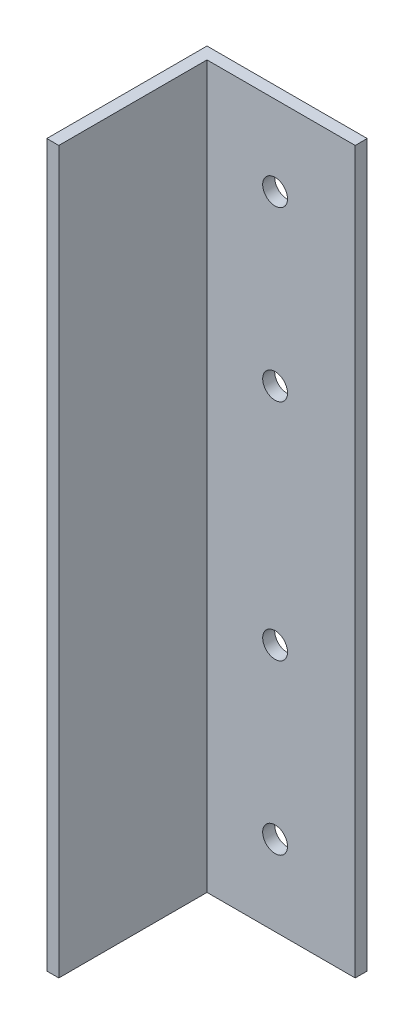
ISO-10303-21;
HEADER;
FILE_DESCRIPTION(('STEP AP214'),'2;1');
FILE_NAME('part.step','',(''),(''),'','','');
FILE_SCHEMA(('AUTOMOTIVE_DESIGN { 1 0 10303 214 1 1 1 1 }'));
ENDSEC;
DATA;
#1=APPLICATION_CONTEXT('core data for automotive mechanical design processes');
#2=APPLICATION_PROTOCOL_DEFINITION('international standard','automotive_design',2000,#1);
#3=PRODUCT_CONTEXT('',#1,'mechanical');
#4=PRODUCT('Part','Part','',(#3));
#5=PRODUCT_RELATED_PRODUCT_CATEGORY('part','',(#4));
#6=PRODUCT_DEFINITION_FORMATION('','',#4);
#7=PRODUCT_DEFINITION_CONTEXT('part definition',#1,'design');
#8=PRODUCT_DEFINITION('design','',#6,#7);
#9=PRODUCT_DEFINITION_SHAPE('','',#8);
#10=(LENGTH_UNIT() NAMED_UNIT(*) SI_UNIT(.MILLI.,.METRE.));
#11=(NAMED_UNIT(*) PLANE_ANGLE_UNIT() SI_UNIT($,.RADIAN.));
#12=(NAMED_UNIT(*) SI_UNIT($,.STERADIAN.) SOLID_ANGLE_UNIT());
#13=UNCERTAINTY_MEASURE_WITH_UNIT(LENGTH_MEASURE(1.E-05),#10,'distance_accuracy_value','');
#14=(GEOMETRIC_REPRESENTATION_CONTEXT(3) GLOBAL_UNCERTAINTY_ASSIGNED_CONTEXT((#13)) GLOBAL_UNIT_ASSIGNED_CONTEXT((#10,
#11,#12)) REPRESENTATION_CONTEXT('',''));
#15=CARTESIAN_POINT('',(0.,0.,0.));
#16=DIRECTION('',(0.,0.,1.));
#17=DIRECTION('',(1.,0.,0.));
#18=AXIS2_PLACEMENT_3D('',#15,#16,#17);
#19=CARTESIAN_POINT('',(-27.9999999999999,20.5,1.5));
#20=DIRECTION('',(1.,0.,0.));
#21=DIRECTION('',(0.,1.,0.));
#22=AXIS2_PLACEMENT_3D('',#19,#20,#21);
#23=PLANE('',#22);
#24=DIRECTION('',(0.,-1.,0.));
#25=VECTOR('',#24,1.);
#26=CARTESIAN_POINT('',(-27.9999999999999,20.5,0.));
#27=LINE('',#26,#25);
#28=CARTESIAN_POINT('',(-27.9999999999999,20.5,0.));
#29=VERTEX_POINT('',#28);
#30=CARTESIAN_POINT('',(-27.9999999999999,-69.5,0.));
#31=VERTEX_POINT('',#30);
#32=EDGE_CURVE('E92',#29,#31,#27,.T.);
#33=ORIENTED_EDGE('',*,*,#32,.T.);
#34=DIRECTION('',(0.,0.,-1.));
#35=VECTOR('',#34,1.);
#36=CARTESIAN_POINT('',(-27.9999999999999,-69.5,1.5));
#37=LINE('',#36,#35);
#38=CARTESIAN_POINT('',(-27.9999999999999,-69.5,20.));
#39=VERTEX_POINT('',#38);
#40=EDGE_CURVE('E11',#39,#31,#37,.T.);
#41=ORIENTED_EDGE('',*,*,#40,.F.);
#42=DIRECTION('',(0.,-1.,0.));
#43=VECTOR('',#42,1.);
#44=CARTESIAN_POINT('',(-27.9999999999999,20.5,20.));
#45=LINE('',#44,#43);
#46=CARTESIAN_POINT('',(-27.9999999999999,20.5,20.));
#47=VERTEX_POINT('',#46);
#48=EDGE_CURVE('E94',#47,#39,#45,.T.);
#49=ORIENTED_EDGE('',*,*,#48,.F.);
#50=DIRECTION('',(0.,0.,-1.));
#51=VECTOR('',#50,1.);
#52=CARTESIAN_POINT('',(-27.9999999999999,20.5,1.5));
#53=LINE('',#52,#51);
#54=EDGE_CURVE('E78',#47,#29,#53,.T.);
#55=ORIENTED_EDGE('',*,*,#54,.T.);
#56=EDGE_LOOP('',(#33,#41,#49,#55));
#57=FACE_BOUND('',#56,.T.);
#58=ADVANCED_FACE('F32',(#57),#23,.F.);
#59=CARTESIAN_POINT('',(-27.9999999999999,-69.5,1.5));
#60=DIRECTION('',(0.,1.,0.));
#61=DIRECTION('',(0.,0.,1.));
#62=AXIS2_PLACEMENT_3D('',#59,#60,#61);
#63=PLANE('',#62);
#64=DIRECTION('',(1.,0.,0.));
#65=VECTOR('',#64,1.);
#66=CARTESIAN_POINT('',(-27.9999999999999,-69.5,0.));
#67=LINE('',#66,#65);
#68=CARTESIAN_POINT('',(-7.99999999999993,-69.5,0.));
#69=VERTEX_POINT('',#68);
#70=EDGE_CURVE('E98',#31,#69,#67,.T.);
#71=ORIENTED_EDGE('',*,*,#70,.T.);
#72=DIRECTION('',(0.,0.,-1.));
#73=VECTOR('',#72,1.);
#74=CARTESIAN_POINT('',(-7.99999999999993,-69.5,1.5));
#75=LINE('',#74,#73);
#76=CARTESIAN_POINT('',(-7.99999999999993,-69.5,1.5));
#77=VERTEX_POINT('',#76);
#78=EDGE_CURVE('E40',#77,#69,#75,.T.);
#79=ORIENTED_EDGE('',*,*,#78,.F.);
#80=DIRECTION('',(1.,0.,0.));
#81=VECTOR('',#80,1.);
#82=CARTESIAN_POINT('',(-27.9999999999999,-69.5,1.5));
#83=LINE('',#82,#81);
#84=CARTESIAN_POINT('',(-26.4999999999999,-69.5,1.5));
#85=VERTEX_POINT('',#84);
#86=EDGE_CURVE('E85',#85,#77,#83,.T.);
#87=ORIENTED_EDGE('',*,*,#86,.F.);
#88=DIRECTION('',(0.,0.,-1.));
#89=VECTOR('',#88,1.);
#90=CARTESIAN_POINT('',(-26.4999999999999,-69.5,20.));
#91=LINE('',#90,#89);
#92=CARTESIAN_POINT('',(-26.4999999999999,-69.5,20.));
#93=VERTEX_POINT('',#92);
#94=EDGE_CURVE('E99',#93,#85,#91,.T.);
#95=ORIENTED_EDGE('',*,*,#94,.F.);
#96=DIRECTION('',(1.,0.,0.));
#97=VECTOR('',#96,1.);
#98=CARTESIAN_POINT('',(-27.9999999999999,-69.5,20.));
#99=LINE('',#98,#97);
#100=EDGE_CURVE('E137',#39,#93,#99,.T.);
#101=ORIENTED_EDGE('',*,*,#100,.F.);
#102=ORIENTED_EDGE('',*,*,#40,.T.);
#103=EDGE_LOOP('',(#71,#79,#87,#95,#101,#102));
#104=FACE_BOUND('',#103,.T.);
#105=ADVANCED_FACE('F193',(#104),#63,.F.);
#106=CARTESIAN_POINT('',(-7.99999999999994,20.5,1.5));
#107=DIRECTION('',(-1.,0.,0.));
#108=DIRECTION('',(0.,-1.,0.));
#109=AXIS2_PLACEMENT_3D('',#106,#107,#108);
#110=PLANE('',#109);
#111=DIRECTION('',(0.,1.,0.));
#112=VECTOR('',#111,1.);
#113=CARTESIAN_POINT('',(-7.99999999999994,20.5,0.));
#114=LINE('',#113,#112);
#115=CARTESIAN_POINT('',(-7.99999999999994,20.5,0.));
#116=VERTEX_POINT('',#115);
#117=EDGE_CURVE('E86',#69,#116,#114,.T.);
#118=ORIENTED_EDGE('',*,*,#117,.T.);
#119=DIRECTION('',(0.,0.,-1.));
#120=VECTOR('',#119,1.);
#121=CARTESIAN_POINT('',(-7.99999999999994,20.5,1.5));
#122=LINE('',#121,#120);
#123=CARTESIAN_POINT('',(-7.99999999999994,20.5,1.5));
#124=VERTEX_POINT('',#123);
#125=EDGE_CURVE('E81',#124,#116,#122,.T.);
#126=ORIENTED_EDGE('',*,*,#125,.F.);
#127=DIRECTION('',(0.,1.,0.));
#128=VECTOR('',#127,1.);
#129=CARTESIAN_POINT('',(-7.99999999999994,20.5,1.5));
#130=LINE('',#129,#128);
#131=EDGE_CURVE('E54',#77,#124,#130,.T.);
#132=ORIENTED_EDGE('',*,*,#131,.F.);
#133=ORIENTED_EDGE('',*,*,#78,.T.);
#134=EDGE_LOOP('',(#118,#126,#132,#133));
#135=FACE_BOUND('',#134,.T.);
#136=ADVANCED_FACE('F197',(#135),#110,.F.);
#137=CARTESIAN_POINT('',(-27.9999999999999,20.5,1.5));
#138=DIRECTION('',(0.,-1.,0.));
#139=DIRECTION('',(0.,0.,-1.));
#140=AXIS2_PLACEMENT_3D('',#137,#138,#139);
#141=PLANE('',#140);
#142=DIRECTION('',(-1.,0.,0.));
#143=VECTOR('',#142,1.);
#144=CARTESIAN_POINT('',(-27.9999999999999,20.5,0.));
#145=LINE('',#144,#143);
#146=EDGE_CURVE('E74',#116,#29,#145,.T.);
#147=ORIENTED_EDGE('',*,*,#146,.T.);
#148=ORIENTED_EDGE('',*,*,#54,.F.);
#149=DIRECTION('',(-1.,0.,0.));
#150=VECTOR('',#149,1.);
#151=CARTESIAN_POINT('',(-27.9999999999999,20.5,20.));
#152=LINE('',#151,#150);
#153=CARTESIAN_POINT('',(-26.4999999999999,20.5,20.));
#154=VERTEX_POINT('',#153);
#155=EDGE_CURVE('E130',#154,#47,#152,.T.);
#156=ORIENTED_EDGE('',*,*,#155,.F.);
#157=DIRECTION('',(0.,0.,-1.));
#158=VECTOR('',#157,1.);
#159=CARTESIAN_POINT('',(-26.4999999999999,20.5,20.));
#160=LINE('',#159,#158);
#161=CARTESIAN_POINT('',(-26.4999999999999,20.5,1.5));
#162=VERTEX_POINT('',#161);
#163=EDGE_CURVE('E103',#154,#162,#160,.T.);
#164=ORIENTED_EDGE('',*,*,#163,.T.);
#165=DIRECTION('',(-1.,0.,0.));
#166=VECTOR('',#165,1.);
#167=CARTESIAN_POINT('',(-27.9999999999999,20.5,1.5));
#168=LINE('',#167,#166);
#169=EDGE_CURVE('E95',#124,#162,#168,.T.);
#170=ORIENTED_EDGE('',*,*,#169,.F.);
#171=ORIENTED_EDGE('',*,*,#125,.T.);
#172=EDGE_LOOP('',(#147,#148,#156,#164,#170,#171));
#173=FACE_BOUND('',#172,.T.);
#174=ADVANCED_FACE('F76',(#173),#141,.F.);
#175=CARTESIAN_POINT('',(0.,0.,1.5));
#176=DIRECTION('',(0.,0.,1.));
#177=DIRECTION('',(1.,0.,0.));
#178=AXIS2_PLACEMENT_3D('',#175,#176,#177);
#179=PLANE('',#178);
#180=CARTESIAN_POINT('',(-17.9999999999999,-38.5,1.5));
#181=DIRECTION('',(0.,0.,1.));
#182=DIRECTION('',(1.,0.,0.));
#183=AXIS2_PLACEMENT_3D('',#180,#181,#182);
#184=CIRCLE('',#183,1.55);
#185=CARTESIAN_POINT('',(-16.4499999999999,-38.5,1.5));
#186=VERTEX_POINT('',#185);
#187=EDGE_CURVE('E160',#186,#186,#184,.T.);
#188=ORIENTED_EDGE('',*,*,#187,.F.);
#189=EDGE_LOOP('',(#188));
#190=FACE_BOUND('',#189,.T.);
#191=CARTESIAN_POINT('',(-17.9999999999999,-59.4999999999999,1.5));
#192=DIRECTION('',(0.,0.,1.));
#193=DIRECTION('',(1.,0.,0.));
#194=AXIS2_PLACEMENT_3D('',#191,#192,#193);
#195=CIRCLE('',#194,1.55);
#196=CARTESIAN_POINT('',(-16.4499999999999,-59.4999999999999,1.5));
#197=VERTEX_POINT('',#196);
#198=EDGE_CURVE('E154',#197,#197,#195,.T.);
#199=ORIENTED_EDGE('',*,*,#198,.F.);
#200=EDGE_LOOP('',(#199));
#201=FACE_BOUND('',#200,.T.);
#202=CARTESIAN_POINT('',(-17.9999999999999,-10.5,1.5));
#203=DIRECTION('',(0.,0.,1.));
#204=DIRECTION('',(1.,0.,0.));
#205=AXIS2_PLACEMENT_3D('',#202,#203,#204);
#206=CIRCLE('',#205,1.55);
#207=CARTESIAN_POINT('',(-16.4499999999999,-10.5,1.5));
#208=VERTEX_POINT('',#207);
#209=EDGE_CURVE('E148',#208,#208,#206,.T.);
#210=ORIENTED_EDGE('',*,*,#209,.F.);
#211=EDGE_LOOP('',(#210));
#212=FACE_BOUND('',#211,.T.);
#213=CARTESIAN_POINT('',(-17.9999999999999,10.5,1.5));
#214=DIRECTION('',(0.,0.,1.));
#215=DIRECTION('',(1.,0.,0.));
#216=AXIS2_PLACEMENT_3D('',#213,#214,#215);
#217=CIRCLE('',#216,1.55);
#218=CARTESIAN_POINT('',(-16.4499999999999,10.5,1.5));
#219=VERTEX_POINT('',#218);
#220=EDGE_CURVE('E129',#219,#219,#217,.T.);
#221=ORIENTED_EDGE('',*,*,#220,.F.);
#222=EDGE_LOOP('',(#221));
#223=FACE_BOUND('',#222,.T.);
#224=DIRECTION('',(0.,1.,0.));
#225=VECTOR('',#224,1.);
#226=CARTESIAN_POINT('',(-26.4999999999999,20.5,1.5));
#227=LINE('',#226,#225);
#228=EDGE_CURVE('E48',#85,#162,#227,.T.);
#229=ORIENTED_EDGE('',*,*,#228,.F.);
#230=ORIENTED_EDGE('',*,*,#86,.T.);
#231=ORIENTED_EDGE('',*,*,#131,.T.);
#232=ORIENTED_EDGE('',*,*,#169,.T.);
#233=EDGE_LOOP('',(#229,#230,#231,#232));
#234=FACE_BOUND('',#233,.T.);
#235=ADVANCED_FACE('F120',(#190,#201,#212,#223,#234),#179,.T.);
#236=CARTESIAN_POINT('',(0.,0.,0.));
#237=DIRECTION('',(0.,0.,1.));
#238=DIRECTION('',(1.,0.,0.));
#239=AXIS2_PLACEMENT_3D('',#236,#237,#238);
#240=PLANE('',#239);
#241=CARTESIAN_POINT('',(-17.9999999999999,-38.5,0.));
#242=DIRECTION('',(0.,0.,-1.));
#243=DIRECTION('',(-1.,0.,0.));
#244=AXIS2_PLACEMENT_3D('',#241,#242,#243);
#245=CIRCLE('',#244,1.55);
#246=CARTESIAN_POINT('',(-19.5499999999999,-38.5,0.));
#247=VERTEX_POINT('',#246);
#248=EDGE_CURVE('E163',#247,#247,#245,.T.);
#249=ORIENTED_EDGE('',*,*,#248,.F.);
#250=EDGE_LOOP('',(#249));
#251=FACE_BOUND('',#250,.T.);
#252=CARTESIAN_POINT('',(-17.9999999999999,-59.4999999999999,0.));
#253=DIRECTION('',(0.,0.,-1.));
#254=DIRECTION('',(-1.,0.,0.));
#255=AXIS2_PLACEMENT_3D('',#252,#253,#254);
#256=CIRCLE('',#255,1.55);
#257=CARTESIAN_POINT('',(-19.5499999999999,-59.4999999999999,0.));
#258=VERTEX_POINT('',#257);
#259=EDGE_CURVE('E157',#258,#258,#256,.T.);
#260=ORIENTED_EDGE('',*,*,#259,.F.);
#261=EDGE_LOOP('',(#260));
#262=FACE_BOUND('',#261,.T.);
#263=CARTESIAN_POINT('',(-17.9999999999999,-10.5,0.));
#264=DIRECTION('',(0.,0.,-1.));
#265=DIRECTION('',(-1.,0.,0.));
#266=AXIS2_PLACEMENT_3D('',#263,#264,#265);
#267=CIRCLE('',#266,1.55);
#268=CARTESIAN_POINT('',(-19.5499999999999,-10.5,0.));
#269=VERTEX_POINT('',#268);
#270=EDGE_CURVE('E151',#269,#269,#267,.T.);
#271=ORIENTED_EDGE('',*,*,#270,.F.);
#272=EDGE_LOOP('',(#271));
#273=FACE_BOUND('',#272,.T.);
#274=CARTESIAN_POINT('',(-17.9999999999999,10.5,0.));
#275=DIRECTION('',(0.,0.,-1.));
#276=DIRECTION('',(-1.,0.,0.));
#277=AXIS2_PLACEMENT_3D('',#274,#275,#276);
#278=CIRCLE('',#277,1.55);
#279=CARTESIAN_POINT('',(-19.5499999999999,10.5,0.));
#280=VERTEX_POINT('',#279);
#281=EDGE_CURVE('E145',#280,#280,#278,.T.);
#282=ORIENTED_EDGE('',*,*,#281,.F.);
#283=EDGE_LOOP('',(#282));
#284=FACE_BOUND('',#283,.T.);
#285=ORIENTED_EDGE('',*,*,#32,.F.);
#286=ORIENTED_EDGE('',*,*,#146,.F.);
#287=ORIENTED_EDGE('',*,*,#117,.F.);
#288=ORIENTED_EDGE('',*,*,#70,.F.);
#289=EDGE_LOOP('',(#285,#286,#287,#288));
#290=FACE_BOUND('',#289,.T.);
#291=ADVANCED_FACE('F97',(#251,#262,#273,#284,#290),#240,.F.);
#292=CARTESIAN_POINT('',(-26.4999999999999,20.5,20.));
#293=DIRECTION('',(-1.,0.,0.));
#294=DIRECTION('',(0.,-1.,0.));
#295=AXIS2_PLACEMENT_3D('',#292,#293,#294);
#296=PLANE('',#295);
#297=ORIENTED_EDGE('',*,*,#228,.T.);
#298=ORIENTED_EDGE('',*,*,#163,.F.);
#299=DIRECTION('',(0.,1.,0.));
#300=VECTOR('',#299,1.);
#301=CARTESIAN_POINT('',(-26.4999999999999,20.5,20.));
#302=LINE('',#301,#300);
#303=EDGE_CURVE('E132',#93,#154,#302,.T.);
#304=ORIENTED_EDGE('',*,*,#303,.F.);
#305=ORIENTED_EDGE('',*,*,#94,.T.);
#306=EDGE_LOOP('',(#297,#298,#304,#305));
#307=FACE_BOUND('',#306,.T.);
#308=ADVANCED_FACE('F125',(#307),#296,.F.);
#309=CARTESIAN_POINT('',(0.,0.,20.));
#310=DIRECTION('',(0.,0.,1.));
#311=DIRECTION('',(1.,0.,0.));
#312=AXIS2_PLACEMENT_3D('',#309,#310,#311);
#313=PLANE('',#312);
#314=ORIENTED_EDGE('',*,*,#48,.T.);
#315=ORIENTED_EDGE('',*,*,#100,.T.);
#316=ORIENTED_EDGE('',*,*,#303,.T.);
#317=ORIENTED_EDGE('',*,*,#155,.T.);
#318=EDGE_LOOP('',(#314,#315,#316,#317));
#319=FACE_BOUND('',#318,.T.);
#320=ADVANCED_FACE('F181',(#319),#313,.T.);
#321=CARTESIAN_POINT('',(-17.9999999999999,10.5,18.5));
#322=DIRECTION('',(0.,0.,-1.));
#323=DIRECTION('',(-1.,0.,0.));
#324=AXIS2_PLACEMENT_3D('',#321,#322,#323);
#325=CYLINDRICAL_SURFACE('',#324,1.55);
#326=ORIENTED_EDGE('',*,*,#220,.T.);
#327=EDGE_LOOP('',(#326));
#328=FACE_BOUND('',#327,.T.);
#329=ORIENTED_EDGE('',*,*,#281,.T.);
#330=EDGE_LOOP('',(#329));
#331=FACE_BOUND('',#330,.T.);
#332=ADVANCED_FACE('F178',(#328,#331),#325,.F.);
#333=CARTESIAN_POINT('',(-17.9999999999999,-10.5,18.5));
#334=DIRECTION('',(0.,0.,-1.));
#335=DIRECTION('',(-1.,0.,0.));
#336=AXIS2_PLACEMENT_3D('',#333,#334,#335);
#337=CYLINDRICAL_SURFACE('',#336,1.55);
#338=ORIENTED_EDGE('',*,*,#209,.T.);
#339=EDGE_LOOP('',(#338));
#340=FACE_BOUND('',#339,.T.);
#341=ORIENTED_EDGE('',*,*,#270,.T.);
#342=EDGE_LOOP('',(#341));
#343=FACE_BOUND('',#342,.T.);
#344=ADVANCED_FACE('F180',(#340,#343),#337,.F.);
#345=CARTESIAN_POINT('',(-17.9999999999999,-59.4999999999999,18.5));
#346=DIRECTION('',(0.,0.,-1.));
#347=DIRECTION('',(-1.,0.,0.));
#348=AXIS2_PLACEMENT_3D('',#345,#346,#347);
#349=CYLINDRICAL_SURFACE('',#348,1.55);
#350=ORIENTED_EDGE('',*,*,#198,.T.);
#351=EDGE_LOOP('',(#350));
#352=FACE_BOUND('',#351,.T.);
#353=ORIENTED_EDGE('',*,*,#259,.T.);
#354=EDGE_LOOP('',(#353));
#355=FACE_BOUND('',#354,.T.);
#356=ADVANCED_FACE('F188',(#352,#355),#349,.F.);
#357=CARTESIAN_POINT('',(-17.9999999999999,-38.5,18.5));
#358=DIRECTION('',(0.,0.,-1.));
#359=DIRECTION('',(-1.,0.,0.));
#360=AXIS2_PLACEMENT_3D('',#357,#358,#359);
#361=CYLINDRICAL_SURFACE('',#360,1.55);
#362=ORIENTED_EDGE('',*,*,#187,.T.);
#363=EDGE_LOOP('',(#362));
#364=FACE_BOUND('',#363,.T.);
#365=ORIENTED_EDGE('',*,*,#248,.T.);
#366=EDGE_LOOP('',(#365));
#367=FACE_BOUND('',#366,.T.);
#368=ADVANCED_FACE('F167',(#364,#367),#361,.F.);
#369=CLOSED_SHELL('',(#58,#105,#136,#174,#235,#291,#308,#320,#332,#344,#356,#368));
#370=MANIFOLD_SOLID_BREP('B2',#369);
#371=ADVANCED_BREP_SHAPE_REPRESENTATION('',(#18,#370),#14);
#372=SHAPE_DEFINITION_REPRESENTATION(#9,#371);
ENDSEC;
END-ISO-10303-21;
